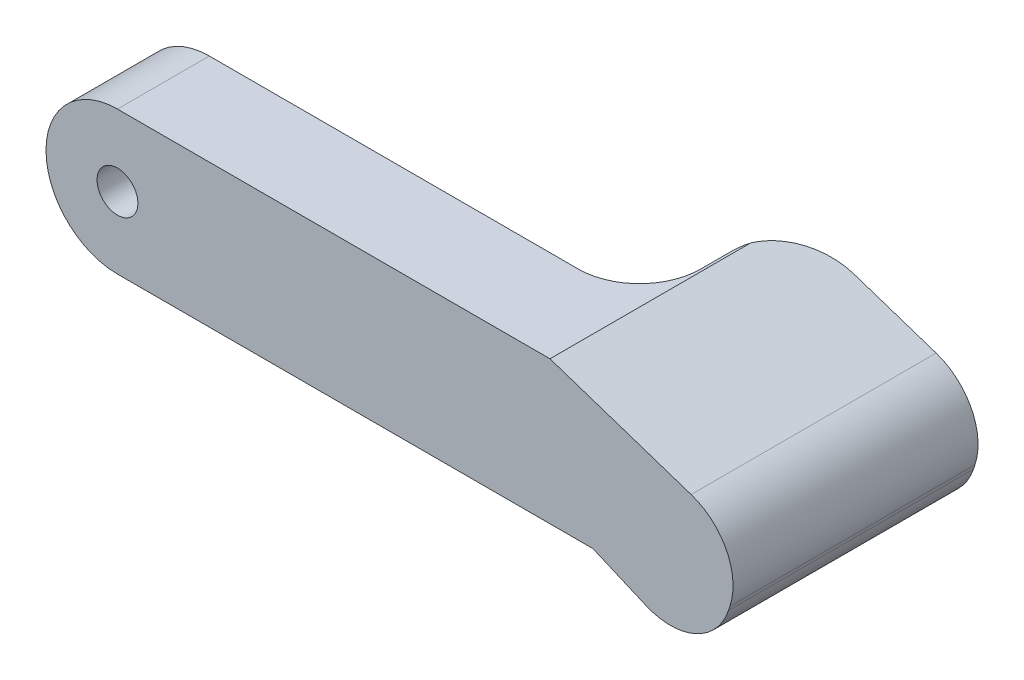
ISO-10303-21;
HEADER;
FILE_DESCRIPTION(('STEP AP214'),'2;1');
FILE_NAME('part.step','',(''),(''),'','','');
FILE_SCHEMA(('AUTOMOTIVE_DESIGN { 1 0 10303 214 1 1 1 1 }'));
ENDSEC;
DATA;
#1=APPLICATION_CONTEXT('core data for automotive mechanical design processes');
#2=APPLICATION_PROTOCOL_DEFINITION('international standard','automotive_design',2000,#1);
#3=PRODUCT_CONTEXT('',#1,'mechanical');
#4=PRODUCT('Part','Part','',(#3));
#5=PRODUCT_RELATED_PRODUCT_CATEGORY('part','',(#4));
#6=PRODUCT_DEFINITION_FORMATION('','',#4);
#7=PRODUCT_DEFINITION_CONTEXT('part definition',#1,'design');
#8=PRODUCT_DEFINITION('design','',#6,#7);
#9=PRODUCT_DEFINITION_SHAPE('','',#8);
#10=(LENGTH_UNIT() NAMED_UNIT(*) SI_UNIT(.MILLI.,.METRE.));
#11=(NAMED_UNIT(*) PLANE_ANGLE_UNIT() SI_UNIT($,.RADIAN.));
#12=(NAMED_UNIT(*) SI_UNIT($,.STERADIAN.) SOLID_ANGLE_UNIT());
#13=UNCERTAINTY_MEASURE_WITH_UNIT(LENGTH_MEASURE(1.E-05),#10,'distance_accuracy_value','');
#14=(GEOMETRIC_REPRESENTATION_CONTEXT(3) GLOBAL_UNCERTAINTY_ASSIGNED_CONTEXT((#13)) GLOBAL_UNIT_ASSIGNED_CONTEXT((#10,
#11,#12)) REPRESENTATION_CONTEXT('',''));
#15=CARTESIAN_POINT('',(0.,0.,0.));
#16=DIRECTION('',(0.,0.,1.));
#17=DIRECTION('',(1.,0.,0.));
#18=AXIS2_PLACEMENT_3D('',#15,#16,#17);
#19=CARTESIAN_POINT('',(0.,0.,12.));
#20=DIRECTION('',(0.,0.,-1.));
#21=DIRECTION('',(-1.,0.,0.));
#22=AXIS2_PLACEMENT_3D('',#19,#20,#21);
#23=CYLINDRICAL_SURFACE('',#22,3.5);
#24=CARTESIAN_POINT('',(0.,0.,7.5));
#25=DIRECTION('',(0.,0.,-1.));
#26=DIRECTION('',(-1.,0.,0.));
#27=AXIS2_PLACEMENT_3D('',#24,#25,#26);
#28=CIRCLE('',#27,3.5);
#29=CARTESIAN_POINT('',(0.,-3.5,7.5));
#30=VERTEX_POINT('',#29);
#31=CARTESIAN_POINT('',(0.,3.5,7.5));
#32=VERTEX_POINT('',#31);
#33=EDGE_CURVE('E161',#30,#32,#28,.T.);
#34=ORIENTED_EDGE('',*,*,#33,.F.);
#35=DIRECTION('',(0.,0.,-1.));
#36=VECTOR('',#35,1.);
#37=CARTESIAN_POINT('',(0.,-3.5,12.));
#38=LINE('',#37,#36);
#39=CARTESIAN_POINT('',(0.,-3.5,12.));
#40=VERTEX_POINT('',#39);
#41=EDGE_CURVE('E167',#40,#30,#38,.T.);
#42=ORIENTED_EDGE('',*,*,#41,.F.);
#43=CARTESIAN_POINT('',(0.,0.,12.));
#44=DIRECTION('',(0.,0.,1.));
#45=DIRECTION('',(1.,0.,0.));
#46=AXIS2_PLACEMENT_3D('',#43,#44,#45);
#47=CIRCLE('',#46,3.5);
#48=CARTESIAN_POINT('',(0.,3.5,12.));
#49=VERTEX_POINT('',#48);
#50=EDGE_CURVE('E170',#49,#40,#47,.T.);
#51=ORIENTED_EDGE('',*,*,#50,.F.);
#52=DIRECTION('',(0.,0.,-1.));
#53=VECTOR('',#52,1.);
#54=CARTESIAN_POINT('',(0.,3.5,12.));
#55=LINE('',#54,#53);
#56=EDGE_CURVE('E150',#49,#32,#55,.T.);
#57=ORIENTED_EDGE('',*,*,#56,.T.);
#58=EDGE_LOOP('',(#34,#42,#51,#57));
#59=FACE_BOUND('',#58,.T.);
#60=ADVANCED_FACE('F56',(#59),#23,.T.);
#61=CARTESIAN_POINT('',(0.,-3.5,12.));
#62=DIRECTION('',(0.,-1.,0.));
#63=DIRECTION('',(0.,0.,-1.));
#64=AXIS2_PLACEMENT_3D('',#61,#62,#63);
#65=PLANE('',#64);
#66=DIRECTION('',(0.,0.,1.));
#67=VECTOR('',#66,1.);
#68=CARTESIAN_POINT('',(21.0685644880471,-3.5,12.));
#69=LINE('',#68,#67);
#70=CARTESIAN_POINT('',(21.0685644880471,-3.5,3.));
#71=VERTEX_POINT('',#70);
#72=CARTESIAN_POINT('',(21.0685644880471,-3.5,4.5));
#73=VERTEX_POINT('',#72);
#74=EDGE_CURVE('E187',#71,#73,#69,.T.);
#75=ORIENTED_EDGE('',*,*,#74,.F.);
#76=CARTESIAN_POINT('',(24.0685644880471,-3.5,3.));
#77=DIRECTION('',(0.,-1.,0.));
#78=DIRECTION('',(0.,0.,-1.));
#79=AXIS2_PLACEMENT_3D('',#76,#77,#78);
#80=CIRCLE('',#79,3.);
#81=CARTESIAN_POINT('',(23.2854435626157,-3.5,0.104016295599803));
#82=VERTEX_POINT('',#81);
#83=EDGE_CURVE('E213',#71,#82,#80,.T.);
#84=ORIENTED_EDGE('',*,*,#83,.T.);
#85=DIRECTION('',(0.,0.,-1.));
#86=VECTOR('',#85,1.);
#87=CARTESIAN_POINT('',(23.2854435626157,-3.5,12.));
#88=LINE('',#87,#86);
#89=CARTESIAN_POINT('',(23.2854435626157,-3.5,12.));
#90=VERTEX_POINT('',#89);
#91=EDGE_CURVE('E175',#90,#82,#88,.T.);
#92=ORIENTED_EDGE('',*,*,#91,.F.);
#93=DIRECTION('',(-1.,0.,0.));
#94=VECTOR('',#93,1.);
#95=CARTESIAN_POINT('',(0.,-3.5,12.));
#96=LINE('',#95,#94);
#97=EDGE_CURVE('E287',#90,#40,#96,.T.);
#98=ORIENTED_EDGE('',*,*,#97,.T.);
#99=ORIENTED_EDGE('',*,*,#41,.T.);
#100=DIRECTION('',(1.,0.,0.));
#101=VECTOR('',#100,1.);
#102=CARTESIAN_POINT('',(0.,-3.5,7.5));
#103=LINE('',#102,#101);
#104=CARTESIAN_POINT('',(18.0685644880471,-3.5,7.5));
#105=VERTEX_POINT('',#104);
#106=EDGE_CURVE('E157',#30,#105,#103,.T.);
#107=ORIENTED_EDGE('',*,*,#106,.T.);
#108=CARTESIAN_POINT('',(18.0685644880471,-3.5,4.5));
#109=DIRECTION('',(0.,-1.,0.));
#110=DIRECTION('',(0.,0.,-1.));
#111=AXIS2_PLACEMENT_3D('',#108,#109,#110);
#112=CIRCLE('',#111,3.);
#113=EDGE_CURVE('E65',#105,#73,#112,.F.);
#114=ORIENTED_EDGE('',*,*,#113,.T.);
#115=EDGE_LOOP('',(#75,#84,#92,#98,#99,#107,#114));
#116=FACE_BOUND('',#115,.T.);
#117=ADVANCED_FACE('F224',(#116),#65,.T.);
#118=CARTESIAN_POINT('',(2.35067671350419,5.48003242972297,12.));
#119=DIRECTION('',(-0.394215586036058,-0.91901799314608,0.));
#120=DIRECTION('',(0.91901799314608,-0.394215586036058,0.));
#121=AXIS2_PLACEMENT_3D('',#118,#119,#120);
#122=PLANE('',#121);
#123=ORIENTED_EDGE('',*,*,#91,.T.);
#124=CARTESIAN_POINT('',(24.0685644880471,-3.83592212215476,3.));
#125=DIRECTION('',(-0.394215586036058,-0.91901799314608,0.));
#126=DIRECTION('',(0.91901799314608,-0.394215586036058,0.));
#127=AXIS2_PLACEMENT_3D('',#124,#125,#126);
#128=ELLIPSE('',#127,3.26435393253845,3.);
#129=CARTESIAN_POINT('',(24.0685644880471,-3.83592212215476,0.));
#130=VERTEX_POINT('',#129);
#131=EDGE_CURVE('E215',#82,#130,#128,.T.);
#132=ORIENTED_EDGE('',*,*,#131,.T.);
#133=DIRECTION('',(-0.91901799314608,0.394215586036058,0.));
#134=VECTOR('',#133,1.);
#135=CARTESIAN_POINT('',(2.35067671350419,5.48003242972297,0.));
#136=LINE('',#135,#134);
#137=CARTESIAN_POINT('',(25.8950907792794,-4.61941617524013,0.));
#138=VERTEX_POINT('',#137);
#139=EDGE_CURVE('E186',#138,#130,#136,.T.);
#140=ORIENTED_EDGE('',*,*,#139,.F.);
#141=DIRECTION('',(0.,0.,-1.));
#142=VECTOR('',#141,1.);
#143=CARTESIAN_POINT('',(25.8950907792794,-4.61941617524013,12.));
#144=LINE('',#143,#142);
#145=CARTESIAN_POINT('',(25.8950907792794,-4.61941617524013,12.));
#146=VERTEX_POINT('',#145);
#147=EDGE_CURVE('E204',#138,#146,#144,.F.);
#148=ORIENTED_EDGE('',*,*,#147,.T.);
#149=DIRECTION('',(-0.91901799314608,0.394215586036058,0.));
#150=VECTOR('',#149,1.);
#151=CARTESIAN_POINT('',(2.35067671350419,5.48003242972297,12.));
#152=LINE('',#151,#150);
#153=EDGE_CURVE('E278',#146,#90,#152,.T.);
#154=ORIENTED_EDGE('',*,*,#153,.T.);
#155=EDGE_LOOP('',(#123,#132,#140,#148,#154));
#156=FACE_BOUND('',#155,.T.);
#157=ADVANCED_FACE('F252',(#156),#122,.T.);
#158=CARTESIAN_POINT('',(27.782030325738,-9.24630488770306,12.));
#159=DIRECTION('',(0.948830446688371,-0.315785977264896,0.));
#160=DIRECTION('',(0.315785977264896,0.948830446688371,0.));
#161=AXIS2_PLACEMENT_3D('',#158,#159,#160);
#162=PLANE('',#161);
#163=DIRECTION('',(-0.315785977264896,-0.948830446688371,0.));
#164=VECTOR('',#163,1.);
#165=CARTESIAN_POINT('',(27.782030325738,-9.24630488770306,0.));
#166=LINE('',#165,#164);
#167=CARTESIAN_POINT('',(29.9957906956791,-2.59470097905269,0.));
#168=VERTEX_POINT('',#167);
#169=CARTESIAN_POINT('',(29.9242288774527,-2.80972012759658,0.));
#170=VERTEX_POINT('',#169);
#171=EDGE_CURVE('E291',#168,#170,#166,.T.);
#172=ORIENTED_EDGE('',*,*,#171,.F.);
#173=DIRECTION('',(0.,0.,-1.));
#174=VECTOR('',#173,1.);
#175=CARTESIAN_POINT('',(29.9957906956791,-2.59470097905269,12.));
#176=LINE('',#175,#174);
#177=CARTESIAN_POINT('',(29.9957906956791,-2.59470097905269,12.));
#178=VERTEX_POINT('',#177);
#179=EDGE_CURVE('E198',#168,#178,#176,.F.);
#180=ORIENTED_EDGE('',*,*,#179,.T.);
#181=DIRECTION('',(-0.315785977264896,-0.948830446688371,0.));
#182=VECTOR('',#181,1.);
#183=CARTESIAN_POINT('',(27.782030325738,-9.24630488770306,12.));
#184=LINE('',#183,#182);
#185=CARTESIAN_POINT('',(29.9242288774527,-2.80972012759658,12.));
#186=VERTEX_POINT('',#185);
#187=EDGE_CURVE('E275',#178,#186,#184,.T.);
#188=ORIENTED_EDGE('',*,*,#187,.T.);
#189=DIRECTION('',(0.,0.,-1.));
#190=VECTOR('',#189,1.);
#191=CARTESIAN_POINT('',(29.9242288774527,-2.80972012759658,12.));
#192=LINE('',#191,#190);
#193=EDGE_CURVE('E195',#186,#170,#192,.T.);
#194=ORIENTED_EDGE('',*,*,#193,.T.);
#195=EDGE_LOOP('',(#172,#180,#188,#194));
#196=FACE_BOUND('',#195,.T.);
#197=ADVANCED_FACE('F281',(#196),#162,.T.);
#198=CARTESIAN_POINT('',(3.16111830173571,9.49809524871548,12.));
#199=DIRECTION('',(0.315785977264896,0.948830446688371,0.));
#200=DIRECTION('',(-0.948830446688372,0.315785977264896,0.));
#201=AXIS2_PLACEMENT_3D('',#198,#199,#200);
#202=PLANE('',#201);
#203=DIRECTION('',(0.948830446688372,-0.315785977264896,0.));
#204=VECTOR('',#203,1.);
#205=CARTESIAN_POINT('',(3.16111830173571,9.49809524871548,0.));
#206=LINE('',#205,#204);
#207=CARTESIAN_POINT('',(24.0685644880471,2.5397621249198,0.));
#208=VERTEX_POINT('',#207);
#209=CARTESIAN_POINT('',(28.0966572874086,1.19914829280711,0.));
#210=VERTEX_POINT('',#209);
#211=EDGE_CURVE('E180',#208,#210,#206,.T.);
#212=ORIENTED_EDGE('',*,*,#211,.F.);
#213=CARTESIAN_POINT('',(24.0685644880471,2.5397621249198,3.));
#214=DIRECTION('',(0.315785977264896,0.948830446688371,0.));
#215=DIRECTION('',(0.948830446688372,-0.315785977264896,0.));
#216=AXIS2_PLACEMENT_3D('',#213,#214,#215);
#217=ELLIPSE('',#216,3.16178724077696,3.);
#218=CARTESIAN_POINT('',(21.1833732587507,3.5,2.17800756062379));
#219=VERTEX_POINT('',#218);
#220=EDGE_CURVE('E72',#208,#219,#217,.T.);
#221=ORIENTED_EDGE('',*,*,#220,.T.);
#222=DIRECTION('',(0.,0.,-1.));
#223=VECTOR('',#222,1.);
#224=CARTESIAN_POINT('',(21.1833732587507,3.5,12.));
#225=LINE('',#224,#223);
#226=CARTESIAN_POINT('',(21.1833732587507,3.5,12.));
#227=VERTEX_POINT('',#226);
#228=EDGE_CURVE('E172',#227,#219,#225,.T.);
#229=ORIENTED_EDGE('',*,*,#228,.F.);
#230=DIRECTION('',(0.948830446688372,-0.315785977264896,0.));
#231=VECTOR('',#230,1.);
#232=CARTESIAN_POINT('',(3.16111830173571,9.49809524871548,12.));
#233=LINE('',#232,#231);
#234=CARTESIAN_POINT('',(28.0966572874086,1.19914829280711,12.));
#235=VERTEX_POINT('',#234);
#236=EDGE_CURVE('E177',#227,#235,#233,.T.);
#237=ORIENTED_EDGE('',*,*,#236,.T.);
#238=DIRECTION('',(0.,0.,-1.));
#239=VECTOR('',#238,1.);
#240=CARTESIAN_POINT('',(28.0966572874086,1.19914829280711,12.));
#241=LINE('',#240,#239);
#242=EDGE_CURVE('E166',#235,#210,#241,.T.);
#243=ORIENTED_EDGE('',*,*,#242,.T.);
#244=EDGE_LOOP('',(#212,#221,#229,#237,#243));
#245=FACE_BOUND('',#244,.T.);
#246=ADVANCED_FACE('F330',(#245),#202,.T.);
#247=CARTESIAN_POINT('',(0.,3.5,12.));
#248=DIRECTION('',(0.,1.,0.));
#249=DIRECTION('',(0.,0.,1.));
#250=AXIS2_PLACEMENT_3D('',#247,#248,#249);
#251=PLANE('',#250);
#252=ORIENTED_EDGE('',*,*,#228,.T.);
#253=CARTESIAN_POINT('',(24.0685644880471,3.5,3.));
#254=DIRECTION('',(0.,1.,0.));
#255=DIRECTION('',(0.,0.,1.));
#256=AXIS2_PLACEMENT_3D('',#253,#254,#255);
#257=CIRCLE('',#256,3.);
#258=CARTESIAN_POINT('',(21.0685644880471,3.5,3.));
#259=VERTEX_POINT('',#258);
#260=EDGE_CURVE('E219',#219,#259,#257,.T.);
#261=ORIENTED_EDGE('',*,*,#260,.T.);
#262=DIRECTION('',(0.,0.,-1.));
#263=VECTOR('',#262,1.);
#264=CARTESIAN_POINT('',(21.0685644880471,3.5,12.));
#265=LINE('',#264,#263);
#266=CARTESIAN_POINT('',(21.0685644880471,3.5,4.5));
#267=VERTEX_POINT('',#266);
#268=EDGE_CURVE('E231',#267,#259,#265,.T.);
#269=ORIENTED_EDGE('',*,*,#268,.F.);
#270=CARTESIAN_POINT('',(18.0685644880471,3.5,4.5));
#271=DIRECTION('',(0.,1.,0.));
#272=DIRECTION('',(0.,0.,1.));
#273=AXIS2_PLACEMENT_3D('',#270,#271,#272);
#274=CIRCLE('',#273,3.);
#275=CARTESIAN_POINT('',(18.0685644880471,3.5,7.5));
#276=VERTEX_POINT('',#275);
#277=EDGE_CURVE('E12',#267,#276,#274,.F.);
#278=ORIENTED_EDGE('',*,*,#277,.T.);
#279=DIRECTION('',(-1.,0.,0.));
#280=VECTOR('',#279,1.);
#281=CARTESIAN_POINT('',(0.,3.5,7.5));
#282=LINE('',#281,#280);
#283=EDGE_CURVE('E145',#276,#32,#282,.T.);
#284=ORIENTED_EDGE('',*,*,#283,.T.);
#285=ORIENTED_EDGE('',*,*,#56,.F.);
#286=DIRECTION('',(1.,0.,0.));
#287=VECTOR('',#286,1.);
#288=CARTESIAN_POINT('',(0.,3.5,12.));
#289=LINE('',#288,#287);
#290=EDGE_CURVE('E173',#49,#227,#289,.T.);
#291=ORIENTED_EDGE('',*,*,#290,.T.);
#292=EDGE_LOOP('',(#252,#261,#269,#278,#284,#285,#291));
#293=FACE_BOUND('',#292,.T.);
#294=ADVANCED_FACE('F147',(#293),#251,.T.);
#295=CARTESIAN_POINT('',(0.,0.,0.));
#296=DIRECTION('',(0.,0.,1.));
#297=DIRECTION('',(1.,0.,0.));
#298=AXIS2_PLACEMENT_3D('',#295,#296,#297);
#299=PLANE('',#298);
#300=ORIENTED_EDGE('',*,*,#139,.T.);
#301=DIRECTION('',(0.,-1.,0.));
#302=VECTOR('',#301,1.);
#303=CARTESIAN_POINT('',(24.0685644880471,0.,0.));
#304=LINE('',#303,#302);
#305=EDGE_CURVE('E80',#130,#208,#304,.F.);
#306=ORIENTED_EDGE('',*,*,#305,.T.);
#307=ORIENTED_EDGE('',*,*,#211,.T.);
#308=CARTESIAN_POINT('',(27.149299355614,-1.647343047258,0.));
#309=DIRECTION('',(0.,0.,1.));
#310=DIRECTION('',(1.,0.,0.));
#311=AXIS2_PLACEMENT_3D('',#308,#309,#310);
#312=CIRCLE('',#311,3.);
#313=EDGE_CURVE('E193',#210,#168,#312,.F.);
#314=ORIENTED_EDGE('',*,*,#313,.T.);
#315=ORIENTED_EDGE('',*,*,#171,.T.);
#316=CARTESIAN_POINT('',(27.0777375373875,-1.8623621958019,0.));
#317=DIRECTION('',(0.,0.,1.));
#318=DIRECTION('',(1.,0.,0.));
#319=AXIS2_PLACEMENT_3D('',#316,#317,#318);
#320=CIRCLE('',#319,3.);
#321=EDGE_CURVE('E191',#170,#138,#320,.F.);
#322=ORIENTED_EDGE('',*,*,#321,.T.);
#323=EDGE_LOOP('',(#300,#306,#307,#314,#315,#322));
#324=FACE_BOUND('',#323,.T.);
#325=ADVANCED_FACE('F324',(#324),#299,.F.);
#326=CARTESIAN_POINT('',(0.,0.,12.));
#327=DIRECTION('',(0.,0.,1.));
#328=DIRECTION('',(1.,0.,0.));
#329=AXIS2_PLACEMENT_3D('',#326,#327,#328);
#330=PLANE('',#329);
#331=CARTESIAN_POINT('',(0.,0.,12.));
#332=DIRECTION('',(0.,0.,1.));
#333=DIRECTION('',(1.,0.,0.));
#334=AXIS2_PLACEMENT_3D('',#331,#332,#333);
#335=CIRCLE('',#334,1.);
#336=CARTESIAN_POINT('',(1.,0.,12.));
#337=VERTEX_POINT('',#336);
#338=EDGE_CURVE('E303',#337,#337,#335,.T.);
#339=ORIENTED_EDGE('',*,*,#338,.F.);
#340=EDGE_LOOP('',(#339));
#341=FACE_BOUND('',#340,.T.);
#342=ORIENTED_EDGE('',*,*,#187,.F.);
#343=CARTESIAN_POINT('',(27.149299355614,-1.647343047258,12.));
#344=DIRECTION('',(0.,0.,1.));
#345=DIRECTION('',(1.,0.,0.));
#346=AXIS2_PLACEMENT_3D('',#343,#344,#345);
#347=CIRCLE('',#346,3.);
#348=EDGE_CURVE('E202',#178,#235,#347,.T.);
#349=ORIENTED_EDGE('',*,*,#348,.T.);
#350=ORIENTED_EDGE('',*,*,#236,.F.);
#351=ORIENTED_EDGE('',*,*,#290,.F.);
#352=ORIENTED_EDGE('',*,*,#50,.T.);
#353=ORIENTED_EDGE('',*,*,#97,.F.);
#354=ORIENTED_EDGE('',*,*,#153,.F.);
#355=CARTESIAN_POINT('',(27.0777375373875,-1.8623621958019,12.));
#356=DIRECTION('',(0.,0.,1.));
#357=DIRECTION('',(1.,0.,0.));
#358=AXIS2_PLACEMENT_3D('',#355,#356,#357);
#359=CIRCLE('',#358,3.);
#360=EDGE_CURVE('E200',#146,#186,#359,.T.);
#361=ORIENTED_EDGE('',*,*,#360,.T.);
#362=EDGE_LOOP('',(#342,#349,#350,#351,#352,#353,#354,#361));
#363=FACE_BOUND('',#362,.T.);
#364=ADVANCED_FACE('F274',(#341,#363),#330,.T.);
#365=CARTESIAN_POINT('',(21.0685644880471,7.82224380847651,7.5));
#366=DIRECTION('',(1.,0.,0.));
#367=DIRECTION('',(0.,0.,-1.));
#368=AXIS2_PLACEMENT_3D('',#365,#366,#367);
#369=PLANE('',#368);
#370=ORIENTED_EDGE('',*,*,#74,.T.);
#371=DIRECTION('',(0.,-1.,0.));
#372=VECTOR('',#371,1.);
#373=CARTESIAN_POINT('',(21.0685644880471,7.82224380847651,4.5));
#374=LINE('',#373,#372);
#375=EDGE_CURVE('E211',#73,#267,#374,.F.);
#376=ORIENTED_EDGE('',*,*,#375,.T.);
#377=ORIENTED_EDGE('',*,*,#268,.T.);
#378=DIRECTION('',(0.,-1.,0.));
#379=VECTOR('',#378,1.);
#380=CARTESIAN_POINT('',(21.0685644880471,7.82224380847651,3.));
#381=LINE('',#380,#379);
#382=EDGE_CURVE('E208',#259,#71,#381,.T.);
#383=ORIENTED_EDGE('',*,*,#382,.T.);
#384=EDGE_LOOP('',(#370,#376,#377,#383));
#385=FACE_BOUND('',#384,.T.);
#386=ADVANCED_FACE('F228',(#385),#369,.F.);
#387=CARTESIAN_POINT('',(0.,0.,7.5));
#388=DIRECTION('',(0.,0.,-1.));
#389=DIRECTION('',(-1.,0.,0.));
#390=AXIS2_PLACEMENT_3D('',#387,#388,#389);
#391=PLANE('',#390);
#392=CARTESIAN_POINT('',(0.,0.,7.5));
#393=DIRECTION('',(0.,0.,-1.));
#394=DIRECTION('',(-1.,0.,0.));
#395=AXIS2_PLACEMENT_3D('',#392,#393,#394);
#396=CIRCLE('',#395,2.25);
#397=CARTESIAN_POINT('',(-2.25,0.,7.5));
#398=VERTEX_POINT('',#397);
#399=EDGE_CURVE('E298',#398,#398,#396,.T.);
#400=ORIENTED_EDGE('',*,*,#399,.F.);
#401=EDGE_LOOP('',(#400));
#402=FACE_BOUND('',#401,.T.);
#403=ORIENTED_EDGE('',*,*,#283,.F.);
#404=DIRECTION('',(0.,-1.,0.));
#405=VECTOR('',#404,1.);
#406=CARTESIAN_POINT('',(18.0685644880471,0.,7.5));
#407=LINE('',#406,#405);
#408=EDGE_CURVE('E206',#276,#105,#407,.T.);
#409=ORIENTED_EDGE('',*,*,#408,.T.);
#410=ORIENTED_EDGE('',*,*,#106,.F.);
#411=ORIENTED_EDGE('',*,*,#33,.T.);
#412=EDGE_LOOP('',(#403,#409,#410,#411));
#413=FACE_BOUND('',#412,.T.);
#414=ADVANCED_FACE('F162',(#402,#413),#391,.T.);
#415=CARTESIAN_POINT('',(27.149299355614,-1.647343047258,12.));
#416=DIRECTION('',(0.,0.,-1.));
#417=DIRECTION('',(-1.,0.,0.));
#418=AXIS2_PLACEMENT_3D('',#415,#416,#417);
#419=CYLINDRICAL_SURFACE('',#418,3.);
#420=ORIENTED_EDGE('',*,*,#348,.F.);
#421=ORIENTED_EDGE('',*,*,#179,.F.);
#422=ORIENTED_EDGE('',*,*,#313,.F.);
#423=ORIENTED_EDGE('',*,*,#242,.F.);
#424=EDGE_LOOP('',(#420,#421,#422,#423));
#425=FACE_BOUND('',#424,.T.);
#426=ADVANCED_FACE('F256',(#425),#419,.T.);
#427=CARTESIAN_POINT('',(27.0777375373875,-1.8623621958019,12.));
#428=DIRECTION('',(0.,0.,-1.));
#429=DIRECTION('',(-1.,0.,0.));
#430=AXIS2_PLACEMENT_3D('',#427,#428,#429);
#431=CYLINDRICAL_SURFACE('',#430,3.);
#432=ORIENTED_EDGE('',*,*,#360,.F.);
#433=ORIENTED_EDGE('',*,*,#147,.F.);
#434=ORIENTED_EDGE('',*,*,#321,.F.);
#435=ORIENTED_EDGE('',*,*,#193,.F.);
#436=EDGE_LOOP('',(#432,#433,#434,#435));
#437=FACE_BOUND('',#436,.T.);
#438=ADVANCED_FACE('F258',(#437),#431,.T.);
#439=CARTESIAN_POINT('',(0.,0.,10.));
#440=DIRECTION('',(0.,0.,-1.));
#441=DIRECTION('',(-1.,0.,0.));
#442=AXIS2_PLACEMENT_3D('',#439,#440,#441);
#443=CYLINDRICAL_SURFACE('',#442,2.25);
#444=CARTESIAN_POINT('',(0.,0.,10.));
#445=DIRECTION('',(0.,0.,-1.));
#446=DIRECTION('',(-1.,0.,0.));
#447=AXIS2_PLACEMENT_3D('',#444,#445,#446);
#448=CIRCLE('',#447,2.25);
#449=CARTESIAN_POINT('',(-2.25,0.,10.));
#450=VERTEX_POINT('',#449);
#451=EDGE_CURVE('E158',#450,#450,#448,.T.);
#452=ORIENTED_EDGE('',*,*,#451,.F.);
#453=EDGE_LOOP('',(#452));
#454=FACE_BOUND('',#453,.T.);
#455=ORIENTED_EDGE('',*,*,#399,.T.);
#456=EDGE_LOOP('',(#455));
#457=FACE_BOUND('',#456,.T.);
#458=ADVANCED_FACE('F243',(#454,#457),#443,.F.);
#459=CARTESIAN_POINT('',(0.,0.,10.));
#460=DIRECTION('',(0.,0.,-1.));
#461=DIRECTION('',(-1.,0.,0.));
#462=AXIS2_PLACEMENT_3D('',#459,#460,#461);
#463=PLANE('',#462);
#464=CARTESIAN_POINT('',(0.,0.,10.));
#465=DIRECTION('',(0.,0.,-1.));
#466=DIRECTION('',(-1.,0.,0.));
#467=AXIS2_PLACEMENT_3D('',#464,#465,#466);
#468=CIRCLE('',#467,1.);
#469=CARTESIAN_POINT('',(-1.,0.,10.));
#470=VERTEX_POINT('',#469);
#471=EDGE_CURVE('E60',#470,#470,#468,.T.);
#472=ORIENTED_EDGE('',*,*,#471,.F.);
#473=EDGE_LOOP('',(#472));
#474=FACE_BOUND('',#473,.T.);
#475=ORIENTED_EDGE('',*,*,#451,.T.);
#476=EDGE_LOOP('',(#475));
#477=FACE_BOUND('',#476,.T.);
#478=ADVANCED_FACE('F235',(#474,#477),#463,.T.);
#479=CARTESIAN_POINT('',(18.0685644880471,0.,4.5));
#480=DIRECTION('',(0.,-1.,0.));
#481=DIRECTION('',(0.,0.,-1.));
#482=AXIS2_PLACEMENT_3D('',#479,#480,#481);
#483=CYLINDRICAL_SURFACE('',#482,3.);
#484=ORIENTED_EDGE('',*,*,#277,.F.);
#485=ORIENTED_EDGE('',*,*,#375,.F.);
#486=ORIENTED_EDGE('',*,*,#113,.F.);
#487=ORIENTED_EDGE('',*,*,#408,.F.);
#488=EDGE_LOOP('',(#484,#485,#486,#487));
#489=FACE_BOUND('',#488,.T.);
#490=ADVANCED_FACE('F233',(#489),#483,.F.);
#491=CARTESIAN_POINT('',(24.0685644880471,7.82224380847651,3.));
#492=DIRECTION('',(0.,-1.,0.));
#493=DIRECTION('',(0.,0.,-1.));
#494=AXIS2_PLACEMENT_3D('',#491,#492,#493);
#495=CYLINDRICAL_SURFACE('',#494,3.);
#496=ORIENTED_EDGE('',*,*,#220,.F.);
#497=ORIENTED_EDGE('',*,*,#305,.F.);
#498=ORIENTED_EDGE('',*,*,#131,.F.);
#499=ORIENTED_EDGE('',*,*,#83,.F.);
#500=ORIENTED_EDGE('',*,*,#382,.F.);
#501=ORIENTED_EDGE('',*,*,#260,.F.);
#502=EDGE_LOOP('',(#496,#497,#498,#499,#500,#501));
#503=FACE_BOUND('',#502,.T.);
#504=ADVANCED_FACE('F58',(#503),#495,.T.);
#505=CARTESIAN_POINT('',(0.,0.,0.));
#506=DIRECTION('',(0.,0.,1.));
#507=DIRECTION('',(1.,0.,0.));
#508=AXIS2_PLACEMENT_3D('',#505,#506,#507);
#509=CYLINDRICAL_SURFACE('',#508,1.);
#510=ORIENTED_EDGE('',*,*,#471,.T.);
#511=EDGE_LOOP('',(#510));
#512=FACE_BOUND('',#511,.T.);
#513=ORIENTED_EDGE('',*,*,#338,.T.);
#514=EDGE_LOOP('',(#513));
#515=FACE_BOUND('',#514,.T.);
#516=ADVANCED_FACE('F240',(#512,#515),#509,.F.);
#517=CLOSED_SHELL('',(#60,#117,#157,#197,#246,#294,#325,#364,#386,#414,#426,#438,#458,#478,#490,
#504,#516));
#518=MANIFOLD_SOLID_BREP('B2',#517);
#519=ADVANCED_BREP_SHAPE_REPRESENTATION('',(#18,#518),#14);
#520=SHAPE_DEFINITION_REPRESENTATION(#9,#519);
ENDSEC;
END-ISO-10303-21;
